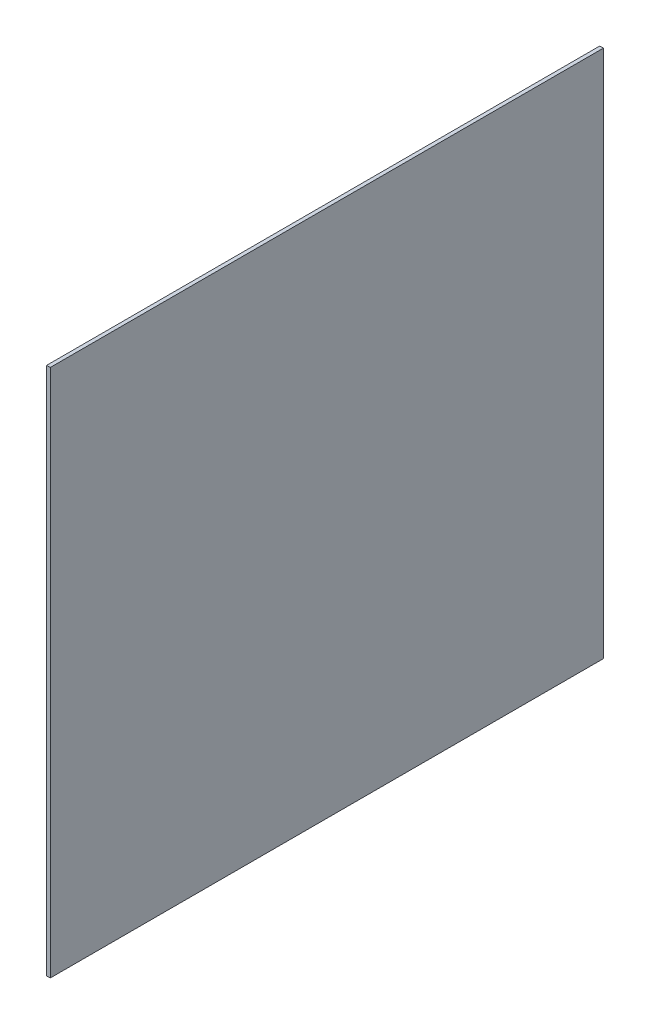
ISO-10303-21;
HEADER;
FILE_DESCRIPTION(('STEP AP214'),'2;1');
FILE_NAME('part.step','',(''),(''),'','','');
FILE_SCHEMA(('AUTOMOTIVE_DESIGN { 1 0 10303 214 1 1 1 1 }'));
ENDSEC;
DATA;
#1=APPLICATION_CONTEXT('core data for automotive mechanical design processes');
#2=APPLICATION_PROTOCOL_DEFINITION('international standard','automotive_design',2000,#1);
#3=PRODUCT_CONTEXT('',#1,'mechanical');
#4=PRODUCT('Part','Part','',(#3));
#5=PRODUCT_RELATED_PRODUCT_CATEGORY('part','',(#4));
#6=PRODUCT_DEFINITION_FORMATION('','',#4);
#7=PRODUCT_DEFINITION_CONTEXT('part definition',#1,'design');
#8=PRODUCT_DEFINITION('design','',#6,#7);
#9=PRODUCT_DEFINITION_SHAPE('','',#8);
#10=(LENGTH_UNIT() NAMED_UNIT(*) SI_UNIT(.MILLI.,.METRE.));
#11=(NAMED_UNIT(*) PLANE_ANGLE_UNIT() SI_UNIT($,.RADIAN.));
#12=(NAMED_UNIT(*) SI_UNIT($,.STERADIAN.) SOLID_ANGLE_UNIT());
#13=UNCERTAINTY_MEASURE_WITH_UNIT(LENGTH_MEASURE(1.E-05),#10,'distance_accuracy_value','');
#14=(GEOMETRIC_REPRESENTATION_CONTEXT(3) GLOBAL_UNCERTAINTY_ASSIGNED_CONTEXT((#13)) GLOBAL_UNIT_ASSIGNED_CONTEXT((#10,
#11,#12)) REPRESENTATION_CONTEXT('',''));
#15=CARTESIAN_POINT('',(0.,0.,0.));
#16=DIRECTION('',(0.,0.,1.));
#17=DIRECTION('',(1.,0.,0.));
#18=AXIS2_PLACEMENT_3D('',#15,#16,#17);
#19=CARTESIAN_POINT('',(3.,217.,-227.));
#20=DIRECTION('',(0.,0.,1.));
#21=DIRECTION('',(0.,-1.,0.));
#22=AXIS2_PLACEMENT_3D('',#19,#20,#21);
#23=PLANE('',#22);
#24=DIRECTION('',(0.,1.,0.));
#25=VECTOR('',#24,1.);
#26=CARTESIAN_POINT('',(0.,217.,-227.));
#27=LINE('',#26,#25);
#28=CARTESIAN_POINT('',(0.,-217.,-227.));
#29=VERTEX_POINT('',#28);
#30=CARTESIAN_POINT('',(0.,217.,-227.));
#31=VERTEX_POINT('',#30);
#32=EDGE_CURVE('E107',#29,#31,#27,.T.);
#33=ORIENTED_EDGE('',*,*,#32,.T.);
#34=DIRECTION('',(-1.,0.,0.));
#35=VECTOR('',#34,1.);
#36=CARTESIAN_POINT('',(3.,217.,-227.));
#37=LINE('',#36,#35);
#38=CARTESIAN_POINT('',(3.,217.,-227.));
#39=VERTEX_POINT('',#38);
#40=EDGE_CURVE('E11',#39,#31,#37,.T.);
#41=ORIENTED_EDGE('',*,*,#40,.F.);
#42=DIRECTION('',(0.,1.,0.));
#43=VECTOR('',#42,1.);
#44=CARTESIAN_POINT('',(3.,217.,-227.));
#45=LINE('',#44,#43);
#46=CARTESIAN_POINT('',(3.,-217.,-227.));
#47=VERTEX_POINT('',#46);
#48=EDGE_CURVE('E91',#47,#39,#45,.T.);
#49=ORIENTED_EDGE('',*,*,#48,.F.);
#50=DIRECTION('',(-1.,0.,0.));
#51=VECTOR('',#50,1.);
#52=CARTESIAN_POINT('',(3.,-217.,-227.));
#53=LINE('',#52,#51);
#54=EDGE_CURVE('E103',#47,#29,#53,.T.);
#55=ORIENTED_EDGE('',*,*,#54,.T.);
#56=EDGE_LOOP('',(#33,#41,#49,#55));
#57=FACE_BOUND('',#56,.T.);
#58=ADVANCED_FACE('F39',(#57),#23,.F.);
#59=CARTESIAN_POINT('',(3.,217.,227.));
#60=DIRECTION('',(0.,-1.,0.));
#61=DIRECTION('',(0.,0.,-1.));
#62=AXIS2_PLACEMENT_3D('',#59,#60,#61);
#63=PLANE('',#62);
#64=DIRECTION('',(0.,0.,1.));
#65=VECTOR('',#64,1.);
#66=CARTESIAN_POINT('',(0.,217.,227.));
#67=LINE('',#66,#65);
#68=CARTESIAN_POINT('',(0.,217.,227.));
#69=VERTEX_POINT('',#68);
#70=EDGE_CURVE('E96',#31,#69,#67,.T.);
#71=ORIENTED_EDGE('',*,*,#70,.T.);
#72=DIRECTION('',(-1.,0.,0.));
#73=VECTOR('',#72,1.);
#74=CARTESIAN_POINT('',(3.,217.,227.));
#75=LINE('',#74,#73);
#76=CARTESIAN_POINT('',(3.,217.,227.));
#77=VERTEX_POINT('',#76);
#78=EDGE_CURVE('E48',#77,#69,#75,.T.);
#79=ORIENTED_EDGE('',*,*,#78,.F.);
#80=DIRECTION('',(0.,0.,1.));
#81=VECTOR('',#80,1.);
#82=CARTESIAN_POINT('',(3.,217.,227.));
#83=LINE('',#82,#81);
#84=EDGE_CURVE('E86',#39,#77,#83,.T.);
#85=ORIENTED_EDGE('',*,*,#84,.F.);
#86=ORIENTED_EDGE('',*,*,#40,.T.);
#87=EDGE_LOOP('',(#71,#79,#85,#86));
#88=FACE_BOUND('',#87,.T.);
#89=ADVANCED_FACE('F95',(#88),#63,.F.);
#90=CARTESIAN_POINT('',(3.,217.,227.));
#91=DIRECTION('',(0.,0.,-1.));
#92=DIRECTION('',(0.,1.,0.));
#93=AXIS2_PLACEMENT_3D('',#90,#91,#92);
#94=PLANE('',#93);
#95=DIRECTION('',(0.,-1.,0.));
#96=VECTOR('',#95,1.);
#97=CARTESIAN_POINT('',(0.,217.,227.));
#98=LINE('',#97,#96);
#99=CARTESIAN_POINT('',(0.,-217.,227.));
#100=VERTEX_POINT('',#99);
#101=EDGE_CURVE('E73',#69,#100,#98,.T.);
#102=ORIENTED_EDGE('',*,*,#101,.T.);
#103=DIRECTION('',(-1.,0.,0.));
#104=VECTOR('',#103,1.);
#105=CARTESIAN_POINT('',(3.,-217.,227.));
#106=LINE('',#105,#104);
#107=CARTESIAN_POINT('',(3.,-217.,227.));
#108=VERTEX_POINT('',#107);
#109=EDGE_CURVE('E98',#108,#100,#106,.T.);
#110=ORIENTED_EDGE('',*,*,#109,.F.);
#111=DIRECTION('',(0.,-1.,0.));
#112=VECTOR('',#111,1.);
#113=CARTESIAN_POINT('',(3.,217.,227.));
#114=LINE('',#113,#112);
#115=EDGE_CURVE('E89',#77,#108,#114,.T.);
#116=ORIENTED_EDGE('',*,*,#115,.F.);
#117=ORIENTED_EDGE('',*,*,#78,.T.);
#118=EDGE_LOOP('',(#102,#110,#116,#117));
#119=FACE_BOUND('',#118,.T.);
#120=ADVANCED_FACE('F99',(#119),#94,.F.);
#121=CARTESIAN_POINT('',(3.,-217.,227.));
#122=DIRECTION('',(0.,1.,0.));
#123=DIRECTION('',(0.,0.,1.));
#124=AXIS2_PLACEMENT_3D('',#121,#122,#123);
#125=PLANE('',#124);
#126=DIRECTION('',(0.,0.,-1.));
#127=VECTOR('',#126,1.);
#128=CARTESIAN_POINT('',(0.,-217.,227.));
#129=LINE('',#128,#127);
#130=EDGE_CURVE('E79',#100,#29,#129,.T.);
#131=ORIENTED_EDGE('',*,*,#130,.T.);
#132=ORIENTED_EDGE('',*,*,#54,.F.);
#133=DIRECTION('',(0.,0.,-1.));
#134=VECTOR('',#133,1.);
#135=CARTESIAN_POINT('',(3.,-217.,227.));
#136=LINE('',#135,#134);
#137=EDGE_CURVE('E56',#108,#47,#136,.T.);
#138=ORIENTED_EDGE('',*,*,#137,.F.);
#139=ORIENTED_EDGE('',*,*,#109,.T.);
#140=EDGE_LOOP('',(#131,#132,#138,#139));
#141=FACE_BOUND('',#140,.T.);
#142=ADVANCED_FACE('F120',(#141),#125,.F.);
#143=CARTESIAN_POINT('',(3.,0.,0.));
#144=DIRECTION('',(1.,0.,0.));
#145=DIRECTION('',(0.,0.,-1.));
#146=AXIS2_PLACEMENT_3D('',#143,#144,#145);
#147=PLANE('',#146);
#148=ORIENTED_EDGE('',*,*,#48,.T.);
#149=ORIENTED_EDGE('',*,*,#84,.T.);
#150=ORIENTED_EDGE('',*,*,#115,.T.);
#151=ORIENTED_EDGE('',*,*,#137,.T.);
#152=EDGE_LOOP('',(#148,#149,#150,#151));
#153=FACE_BOUND('',#152,.T.);
#154=ADVANCED_FACE('F87',(#153),#147,.T.);
#155=CARTESIAN_POINT('',(0.,0.,0.));
#156=DIRECTION('',(1.,0.,0.));
#157=DIRECTION('',(0.,0.,-1.));
#158=AXIS2_PLACEMENT_3D('',#155,#156,#157);
#159=PLANE('',#158);
#160=ORIENTED_EDGE('',*,*,#32,.F.);
#161=ORIENTED_EDGE('',*,*,#130,.F.);
#162=ORIENTED_EDGE('',*,*,#101,.F.);
#163=ORIENTED_EDGE('',*,*,#70,.F.);
#164=EDGE_LOOP('',(#160,#161,#162,#163));
#165=FACE_BOUND('',#164,.T.);
#166=ADVANCED_FACE('F123',(#165),#159,.F.);
#167=CLOSED_SHELL('',(#58,#89,#120,#142,#154,#166));
#168=MANIFOLD_SOLID_BREP('B2',#167);
#169=ADVANCED_BREP_SHAPE_REPRESENTATION('',(#18,#168),#14);
#170=SHAPE_DEFINITION_REPRESENTATION(#9,#169);
ENDSEC;
END-ISO-10303-21;
